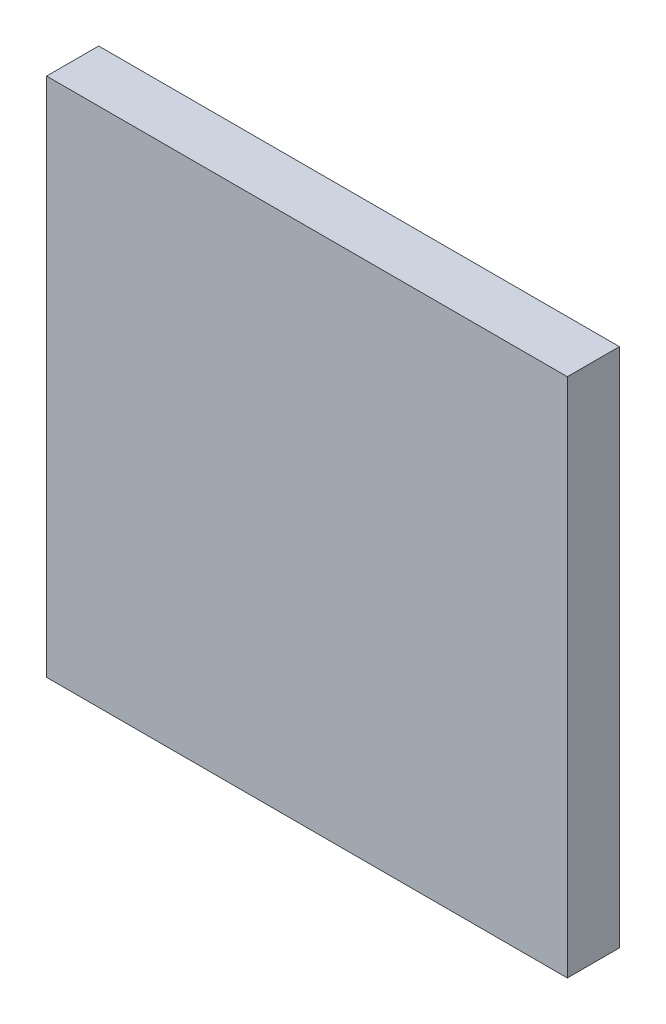
ISO-10303-21;
HEADER;
FILE_DESCRIPTION(('STEP AP214'),'2;1');
FILE_NAME('part.step','',(''),(''),'','','');
FILE_SCHEMA(('AUTOMOTIVE_DESIGN { 1 0 10303 214 1 1 1 1 }'));
ENDSEC;
DATA;
#1=APPLICATION_CONTEXT('core data for automotive mechanical design processes');
#2=APPLICATION_PROTOCOL_DEFINITION('international standard','automotive_design',2000,#1);
#3=PRODUCT_CONTEXT('',#1,'mechanical');
#4=PRODUCT('Part','Part','',(#3));
#5=PRODUCT_RELATED_PRODUCT_CATEGORY('part','',(#4));
#6=PRODUCT_DEFINITION_FORMATION('','',#4);
#7=PRODUCT_DEFINITION_CONTEXT('part definition',#1,'design');
#8=PRODUCT_DEFINITION('design','',#6,#7);
#9=PRODUCT_DEFINITION_SHAPE('','',#8);
#10=(LENGTH_UNIT() NAMED_UNIT(*) SI_UNIT(.MILLI.,.METRE.));
#11=(NAMED_UNIT(*) PLANE_ANGLE_UNIT() SI_UNIT($,.RADIAN.));
#12=(NAMED_UNIT(*) SI_UNIT($,.STERADIAN.) SOLID_ANGLE_UNIT());
#13=UNCERTAINTY_MEASURE_WITH_UNIT(LENGTH_MEASURE(1.E-05),#10,'distance_accuracy_value','');
#14=(GEOMETRIC_REPRESENTATION_CONTEXT(3) GLOBAL_UNCERTAINTY_ASSIGNED_CONTEXT((#13)) GLOBAL_UNIT_ASSIGNED_CONTEXT((#10,
#11,#12)) REPRESENTATION_CONTEXT('',''));
#15=CARTESIAN_POINT('',(0.,0.,0.));
#16=DIRECTION('',(0.,0.,1.));
#17=DIRECTION('',(1.,0.,0.));
#18=AXIS2_PLACEMENT_3D('',#15,#16,#17);
#19=CARTESIAN_POINT('',(50.,-50.,10.));
#20=DIRECTION('',(-1.,0.,0.));
#21=DIRECTION('',(0.,0.,1.));
#22=AXIS2_PLACEMENT_3D('',#19,#20,#21);
#23=PLANE('',#22);
#24=DIRECTION('',(0.,1.,0.));
#25=VECTOR('',#24,1.);
#26=CARTESIAN_POINT('',(50.,-50.,0.));
#27=LINE('',#26,#25);
#28=CARTESIAN_POINT('',(50.,-50.,0.));
#29=VERTEX_POINT('',#28);
#30=CARTESIAN_POINT('',(50.,50.,0.));
#31=VERTEX_POINT('',#30);
#32=EDGE_CURVE('E104',#29,#31,#27,.T.);
#33=ORIENTED_EDGE('',*,*,#32,.T.);
#34=DIRECTION('',(0.,0.,-1.));
#35=VECTOR('',#34,1.);
#36=CARTESIAN_POINT('',(50.,50.,10.));
#37=LINE('',#36,#35);
#38=CARTESIAN_POINT('',(50.,50.,10.));
#39=VERTEX_POINT('',#38);
#40=EDGE_CURVE('E11',#39,#31,#37,.T.);
#41=ORIENTED_EDGE('',*,*,#40,.F.);
#42=DIRECTION('',(0.,1.,0.));
#43=VECTOR('',#42,1.);
#44=CARTESIAN_POINT('',(50.,-50.,10.));
#45=LINE('',#44,#43);
#46=CARTESIAN_POINT('',(50.,-50.,10.));
#47=VERTEX_POINT('',#46);
#48=EDGE_CURVE('E92',#47,#39,#45,.T.);
#49=ORIENTED_EDGE('',*,*,#48,.F.);
#50=DIRECTION('',(0.,0.,-1.));
#51=VECTOR('',#50,1.);
#52=CARTESIAN_POINT('',(50.,-50.,10.));
#53=LINE('',#52,#51);
#54=EDGE_CURVE('E100',#47,#29,#53,.T.);
#55=ORIENTED_EDGE('',*,*,#54,.T.);
#56=EDGE_LOOP('',(#33,#41,#49,#55));
#57=FACE_BOUND('',#56,.T.);
#58=ADVANCED_FACE('F41',(#57),#23,.F.);
#59=CARTESIAN_POINT('',(-50.,50.,10.));
#60=DIRECTION('',(0.,-1.,0.));
#61=DIRECTION('',(0.,0.,-1.));
#62=AXIS2_PLACEMENT_3D('',#59,#60,#61);
#63=PLANE('',#62);
#64=DIRECTION('',(-1.,0.,0.));
#65=VECTOR('',#64,1.);
#66=CARTESIAN_POINT('',(-50.,50.,0.));
#67=LINE('',#66,#65);
#68=CARTESIAN_POINT('',(-50.,50.,0.));
#69=VERTEX_POINT('',#68);
#70=EDGE_CURVE('E96',#31,#69,#67,.T.);
#71=ORIENTED_EDGE('',*,*,#70,.T.);
#72=DIRECTION('',(0.,0.,-1.));
#73=VECTOR('',#72,1.);
#74=CARTESIAN_POINT('',(-50.,50.,10.));
#75=LINE('',#74,#73);
#76=CARTESIAN_POINT('',(-50.,50.,10.));
#77=VERTEX_POINT('',#76);
#78=EDGE_CURVE('E49',#77,#69,#75,.T.);
#79=ORIENTED_EDGE('',*,*,#78,.F.);
#80=DIRECTION('',(-1.,0.,0.));
#81=VECTOR('',#80,1.);
#82=CARTESIAN_POINT('',(-50.,50.,10.));
#83=LINE('',#82,#81);
#84=EDGE_CURVE('E87',#39,#77,#83,.T.);
#85=ORIENTED_EDGE('',*,*,#84,.F.);
#86=ORIENTED_EDGE('',*,*,#40,.T.);
#87=EDGE_LOOP('',(#71,#79,#85,#86));
#88=FACE_BOUND('',#87,.T.);
#89=ADVANCED_FACE('F95',(#88),#63,.F.);
#90=CARTESIAN_POINT('',(-50.,-50.,10.));
#91=DIRECTION('',(1.,0.,0.));
#92=DIRECTION('',(0.,0.,-1.));
#93=AXIS2_PLACEMENT_3D('',#90,#91,#92);
#94=PLANE('',#93);
#95=DIRECTION('',(0.,-1.,0.));
#96=VECTOR('',#95,1.);
#97=CARTESIAN_POINT('',(-50.,-50.,0.));
#98=LINE('',#97,#96);
#99=CARTESIAN_POINT('',(-50.,-50.,0.));
#100=VERTEX_POINT('',#99);
#101=EDGE_CURVE('E74',#69,#100,#98,.T.);
#102=ORIENTED_EDGE('',*,*,#101,.T.);
#103=DIRECTION('',(0.,0.,-1.));
#104=VECTOR('',#103,1.);
#105=CARTESIAN_POINT('',(-50.,-50.,10.));
#106=LINE('',#105,#104);
#107=CARTESIAN_POINT('',(-50.,-50.,10.));
#108=VERTEX_POINT('',#107);
#109=EDGE_CURVE('E97',#108,#100,#106,.T.);
#110=ORIENTED_EDGE('',*,*,#109,.F.);
#111=DIRECTION('',(0.,-1.,0.));
#112=VECTOR('',#111,1.);
#113=CARTESIAN_POINT('',(-50.,-50.,10.));
#114=LINE('',#113,#112);
#115=EDGE_CURVE('E90',#77,#108,#114,.T.);
#116=ORIENTED_EDGE('',*,*,#115,.F.);
#117=ORIENTED_EDGE('',*,*,#78,.T.);
#118=EDGE_LOOP('',(#102,#110,#116,#117));
#119=FACE_BOUND('',#118,.T.);
#120=ADVANCED_FACE('F98',(#119),#94,.F.);
#121=CARTESIAN_POINT('',(-50.,-50.,10.));
#122=DIRECTION('',(0.,1.,0.));
#123=DIRECTION('',(0.,0.,1.));
#124=AXIS2_PLACEMENT_3D('',#121,#122,#123);
#125=PLANE('',#124);
#126=DIRECTION('',(1.,0.,0.));
#127=VECTOR('',#126,1.);
#128=CARTESIAN_POINT('',(-50.,-50.,0.));
#129=LINE('',#128,#127);
#130=EDGE_CURVE('E80',#100,#29,#129,.T.);
#131=ORIENTED_EDGE('',*,*,#130,.T.);
#132=ORIENTED_EDGE('',*,*,#54,.F.);
#133=DIRECTION('',(1.,0.,0.));
#134=VECTOR('',#133,1.);
#135=CARTESIAN_POINT('',(-50.,-50.,10.));
#136=LINE('',#135,#134);
#137=EDGE_CURVE('E57',#108,#47,#136,.T.);
#138=ORIENTED_EDGE('',*,*,#137,.F.);
#139=ORIENTED_EDGE('',*,*,#109,.T.);
#140=EDGE_LOOP('',(#131,#132,#138,#139));
#141=FACE_BOUND('',#140,.T.);
#142=ADVANCED_FACE('F111',(#141),#125,.F.);
#143=CARTESIAN_POINT('',(0.,0.,10.));
#144=DIRECTION('',(0.,0.,-1.));
#145=DIRECTION('',(-1.,0.,0.));
#146=AXIS2_PLACEMENT_3D('',#143,#144,#145);
#147=PLANE('',#146);
#148=ORIENTED_EDGE('',*,*,#48,.T.);
#149=ORIENTED_EDGE('',*,*,#84,.T.);
#150=ORIENTED_EDGE('',*,*,#115,.T.);
#151=ORIENTED_EDGE('',*,*,#137,.T.);
#152=EDGE_LOOP('',(#148,#149,#150,#151));
#153=FACE_BOUND('',#152,.T.);
#154=ADVANCED_FACE('F88',(#153),#147,.F.);
#155=CARTESIAN_POINT('',(0.,0.,0.));
#156=DIRECTION('',(0.,0.,-1.));
#157=DIRECTION('',(-1.,0.,0.));
#158=AXIS2_PLACEMENT_3D('',#155,#156,#157);
#159=PLANE('',#158);
#160=ORIENTED_EDGE('',*,*,#32,.F.);
#161=ORIENTED_EDGE('',*,*,#130,.F.);
#162=ORIENTED_EDGE('',*,*,#101,.F.);
#163=ORIENTED_EDGE('',*,*,#70,.F.);
#164=EDGE_LOOP('',(#160,#161,#162,#163));
#165=FACE_BOUND('',#164,.T.);
#166=ADVANCED_FACE('F114',(#165),#159,.T.);
#167=CLOSED_SHELL('',(#58,#89,#120,#142,#154,#166));
#168=MANIFOLD_SOLID_BREP('B2',#167);
#169=ADVANCED_BREP_SHAPE_REPRESENTATION('',(#18,#168),#14);
#170=SHAPE_DEFINITION_REPRESENTATION(#9,#169);
ENDSEC;
END-ISO-10303-21;
